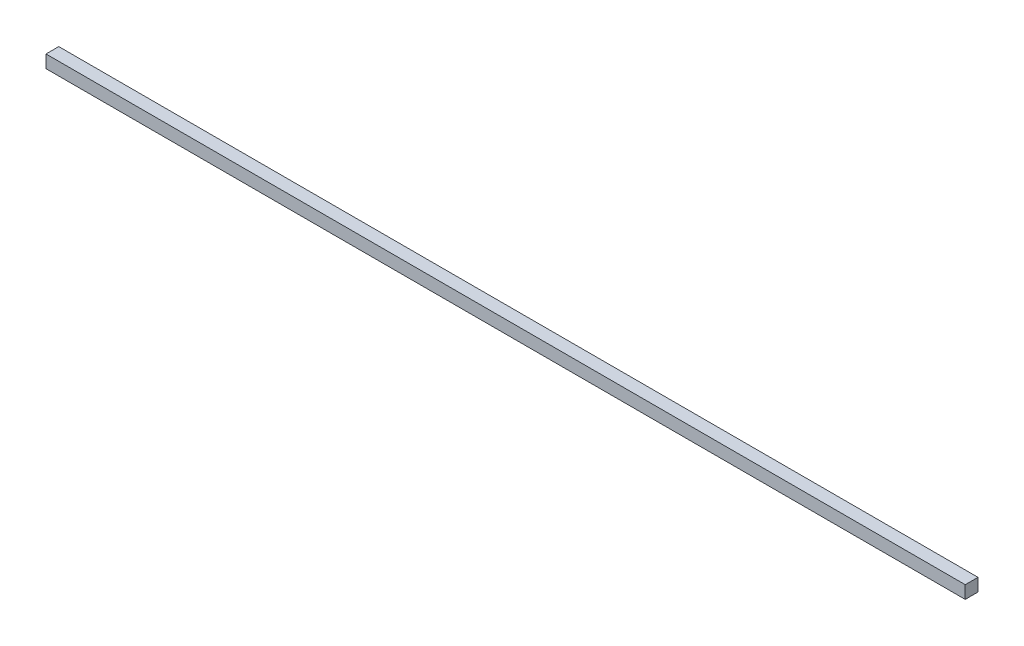
ISO-10303-21;
HEADER;
FILE_DESCRIPTION(('STEP AP214'),'2;1');
FILE_NAME('part.step','',(''),(''),'','','');
FILE_SCHEMA(('AUTOMOTIVE_DESIGN { 1 0 10303 214 1 1 1 1 }'));
ENDSEC;
DATA;
#1=APPLICATION_CONTEXT('core data for automotive mechanical design processes');
#2=APPLICATION_PROTOCOL_DEFINITION('international standard','automotive_design',2000,#1);
#3=PRODUCT_CONTEXT('',#1,'mechanical');
#4=PRODUCT('Part','Part','',(#3));
#5=PRODUCT_RELATED_PRODUCT_CATEGORY('part','',(#4));
#6=PRODUCT_DEFINITION_FORMATION('','',#4);
#7=PRODUCT_DEFINITION_CONTEXT('part definition',#1,'design');
#8=PRODUCT_DEFINITION('design','',#6,#7);
#9=PRODUCT_DEFINITION_SHAPE('','',#8);
#10=(LENGTH_UNIT() NAMED_UNIT(*) SI_UNIT(.MILLI.,.METRE.));
#11=(NAMED_UNIT(*) PLANE_ANGLE_UNIT() SI_UNIT($,.RADIAN.));
#12=(NAMED_UNIT(*) SI_UNIT($,.STERADIAN.) SOLID_ANGLE_UNIT());
#13=UNCERTAINTY_MEASURE_WITH_UNIT(LENGTH_MEASURE(1.E-05),#10,'distance_accuracy_value','');
#14=(GEOMETRIC_REPRESENTATION_CONTEXT(3) GLOBAL_UNCERTAINTY_ASSIGNED_CONTEXT((#13)) GLOBAL_UNIT_ASSIGNED_CONTEXT((#10,
#11,#12)) REPRESENTATION_CONTEXT('',''));
#15=CARTESIAN_POINT('',(0.,0.,0.));
#16=DIRECTION('',(0.,0.,1.));
#17=DIRECTION('',(1.,0.,0.));
#18=AXIS2_PLACEMENT_3D('',#15,#16,#17);
#19=CARTESIAN_POINT('',(0.,6.35,6.35));
#20=DIRECTION('',(1.,0.,0.));
#21=DIRECTION('',(0.,1.,0.));
#22=AXIS2_PLACEMENT_3D('',#19,#20,#21);
#23=PLANE('',#22);
#24=DIRECTION('',(0.,-1.,0.));
#25=VECTOR('',#24,1.);
#26=CARTESIAN_POINT('',(0.,6.35,0.));
#27=LINE('',#26,#25);
#28=CARTESIAN_POINT('',(0.,6.35,0.));
#29=VERTEX_POINT('',#28);
#30=CARTESIAN_POINT('',(0.,0.,0.));
#31=VERTEX_POINT('',#30);
#32=EDGE_CURVE('E102',#29,#31,#27,.T.);
#33=ORIENTED_EDGE('',*,*,#32,.T.);
#34=DIRECTION('',(0.,0.,-1.));
#35=VECTOR('',#34,1.);
#36=CARTESIAN_POINT('',(0.,0.,6.35));
#37=LINE('',#36,#35);
#38=CARTESIAN_POINT('',(0.,0.,6.35));
#39=VERTEX_POINT('',#38);
#40=EDGE_CURVE('E11',#39,#31,#37,.T.);
#41=ORIENTED_EDGE('',*,*,#40,.F.);
#42=DIRECTION('',(0.,-1.,0.));
#43=VECTOR('',#42,1.);
#44=CARTESIAN_POINT('',(0.,6.35,6.35));
#45=LINE('',#44,#43);
#46=CARTESIAN_POINT('',(0.,6.35,6.35));
#47=VERTEX_POINT('',#46);
#48=EDGE_CURVE('E90',#47,#39,#45,.T.);
#49=ORIENTED_EDGE('',*,*,#48,.F.);
#50=DIRECTION('',(0.,0.,-1.));
#51=VECTOR('',#50,1.);
#52=CARTESIAN_POINT('',(0.,6.35,6.35));
#53=LINE('',#52,#51);
#54=EDGE_CURVE('E98',#47,#29,#53,.T.);
#55=ORIENTED_EDGE('',*,*,#54,.T.);
#56=EDGE_LOOP('',(#33,#41,#49,#55));
#57=FACE_BOUND('',#56,.T.);
#58=ADVANCED_FACE('F39',(#57),#23,.F.);
#59=CARTESIAN_POINT('',(0.,0.,6.35));
#60=DIRECTION('',(0.,1.,0.));
#61=DIRECTION('',(0.,0.,1.));
#62=AXIS2_PLACEMENT_3D('',#59,#60,#61);
#63=PLANE('',#62);
#64=DIRECTION('',(1.,0.,0.));
#65=VECTOR('',#64,1.);
#66=CARTESIAN_POINT('',(0.,0.,0.));
#67=LINE('',#66,#65);
#68=CARTESIAN_POINT('',(457.2,0.,0.));
#69=VERTEX_POINT('',#68);
#70=EDGE_CURVE('E94',#31,#69,#67,.T.);
#71=ORIENTED_EDGE('',*,*,#70,.T.);
#72=DIRECTION('',(0.,0.,-1.));
#73=VECTOR('',#72,1.);
#74=CARTESIAN_POINT('',(457.2,0.,6.35));
#75=LINE('',#74,#73);
#76=CARTESIAN_POINT('',(457.2,0.,6.35));
#77=VERTEX_POINT('',#76);
#78=EDGE_CURVE('E47',#77,#69,#75,.T.);
#79=ORIENTED_EDGE('',*,*,#78,.F.);
#80=DIRECTION('',(1.,0.,0.));
#81=VECTOR('',#80,1.);
#82=CARTESIAN_POINT('',(0.,0.,6.35));
#83=LINE('',#82,#81);
#84=EDGE_CURVE('E85',#39,#77,#83,.T.);
#85=ORIENTED_EDGE('',*,*,#84,.F.);
#86=ORIENTED_EDGE('',*,*,#40,.T.);
#87=EDGE_LOOP('',(#71,#79,#85,#86));
#88=FACE_BOUND('',#87,.T.);
#89=ADVANCED_FACE('F93',(#88),#63,.F.);
#90=CARTESIAN_POINT('',(457.2,6.35,6.35));
#91=DIRECTION('',(-1.,0.,0.));
#92=DIRECTION('',(0.,0.,1.));
#93=AXIS2_PLACEMENT_3D('',#90,#91,#92);
#94=PLANE('',#93);
#95=DIRECTION('',(0.,1.,0.));
#96=VECTOR('',#95,1.);
#97=CARTESIAN_POINT('',(457.2,6.35,0.));
#98=LINE('',#97,#96);
#99=CARTESIAN_POINT('',(457.2,6.35,0.));
#100=VERTEX_POINT('',#99);
#101=EDGE_CURVE('E72',#69,#100,#98,.T.);
#102=ORIENTED_EDGE('',*,*,#101,.T.);
#103=DIRECTION('',(0.,0.,-1.));
#104=VECTOR('',#103,1.);
#105=CARTESIAN_POINT('',(457.2,6.35,6.35));
#106=LINE('',#105,#104);
#107=CARTESIAN_POINT('',(457.2,6.35,6.35));
#108=VERTEX_POINT('',#107);
#109=EDGE_CURVE('E95',#108,#100,#106,.T.);
#110=ORIENTED_EDGE('',*,*,#109,.F.);
#111=DIRECTION('',(0.,1.,0.));
#112=VECTOR('',#111,1.);
#113=CARTESIAN_POINT('',(457.2,6.35,6.35));
#114=LINE('',#113,#112);
#115=EDGE_CURVE('E88',#77,#108,#114,.T.);
#116=ORIENTED_EDGE('',*,*,#115,.F.);
#117=ORIENTED_EDGE('',*,*,#78,.T.);
#118=EDGE_LOOP('',(#102,#110,#116,#117));
#119=FACE_BOUND('',#118,.T.);
#120=ADVANCED_FACE('F96',(#119),#94,.F.);
#121=CARTESIAN_POINT('',(0.,6.35,6.35));
#122=DIRECTION('',(0.,-1.,0.));
#123=DIRECTION('',(0.,0.,-1.));
#124=AXIS2_PLACEMENT_3D('',#121,#122,#123);
#125=PLANE('',#124);
#126=DIRECTION('',(-1.,0.,0.));
#127=VECTOR('',#126,1.);
#128=CARTESIAN_POINT('',(0.,6.35,0.));
#129=LINE('',#128,#127);
#130=EDGE_CURVE('E78',#100,#29,#129,.T.);
#131=ORIENTED_EDGE('',*,*,#130,.T.);
#132=ORIENTED_EDGE('',*,*,#54,.F.);
#133=DIRECTION('',(-1.,0.,0.));
#134=VECTOR('',#133,1.);
#135=CARTESIAN_POINT('',(0.,6.35,6.35));
#136=LINE('',#135,#134);
#137=EDGE_CURVE('E55',#108,#47,#136,.T.);
#138=ORIENTED_EDGE('',*,*,#137,.F.);
#139=ORIENTED_EDGE('',*,*,#109,.T.);
#140=EDGE_LOOP('',(#131,#132,#138,#139));
#141=FACE_BOUND('',#140,.T.);
#142=ADVANCED_FACE('F109',(#141),#125,.F.);
#143=CARTESIAN_POINT('',(0.,0.,6.35));
#144=DIRECTION('',(0.,0.,1.));
#145=DIRECTION('',(1.,0.,0.));
#146=AXIS2_PLACEMENT_3D('',#143,#144,#145);
#147=PLANE('',#146);
#148=ORIENTED_EDGE('',*,*,#48,.T.);
#149=ORIENTED_EDGE('',*,*,#84,.T.);
#150=ORIENTED_EDGE('',*,*,#115,.T.);
#151=ORIENTED_EDGE('',*,*,#137,.T.);
#152=EDGE_LOOP('',(#148,#149,#150,#151));
#153=FACE_BOUND('',#152,.T.);
#154=ADVANCED_FACE('F86',(#153),#147,.T.);
#155=CARTESIAN_POINT('',(0.,0.,0.));
#156=DIRECTION('',(0.,0.,1.));
#157=DIRECTION('',(1.,0.,0.));
#158=AXIS2_PLACEMENT_3D('',#155,#156,#157);
#159=PLANE('',#158);
#160=ORIENTED_EDGE('',*,*,#32,.F.);
#161=ORIENTED_EDGE('',*,*,#130,.F.);
#162=ORIENTED_EDGE('',*,*,#101,.F.);
#163=ORIENTED_EDGE('',*,*,#70,.F.);
#164=EDGE_LOOP('',(#160,#161,#162,#163));
#165=FACE_BOUND('',#164,.T.);
#166=ADVANCED_FACE('F112',(#165),#159,.F.);
#167=CLOSED_SHELL('',(#58,#89,#120,#142,#154,#166));
#168=MANIFOLD_SOLID_BREP('B2',#167);
#169=ADVANCED_BREP_SHAPE_REPRESENTATION('',(#18,#168),#14);
#170=SHAPE_DEFINITION_REPRESENTATION(#9,#169);
ENDSEC;
END-ISO-10303-21;
